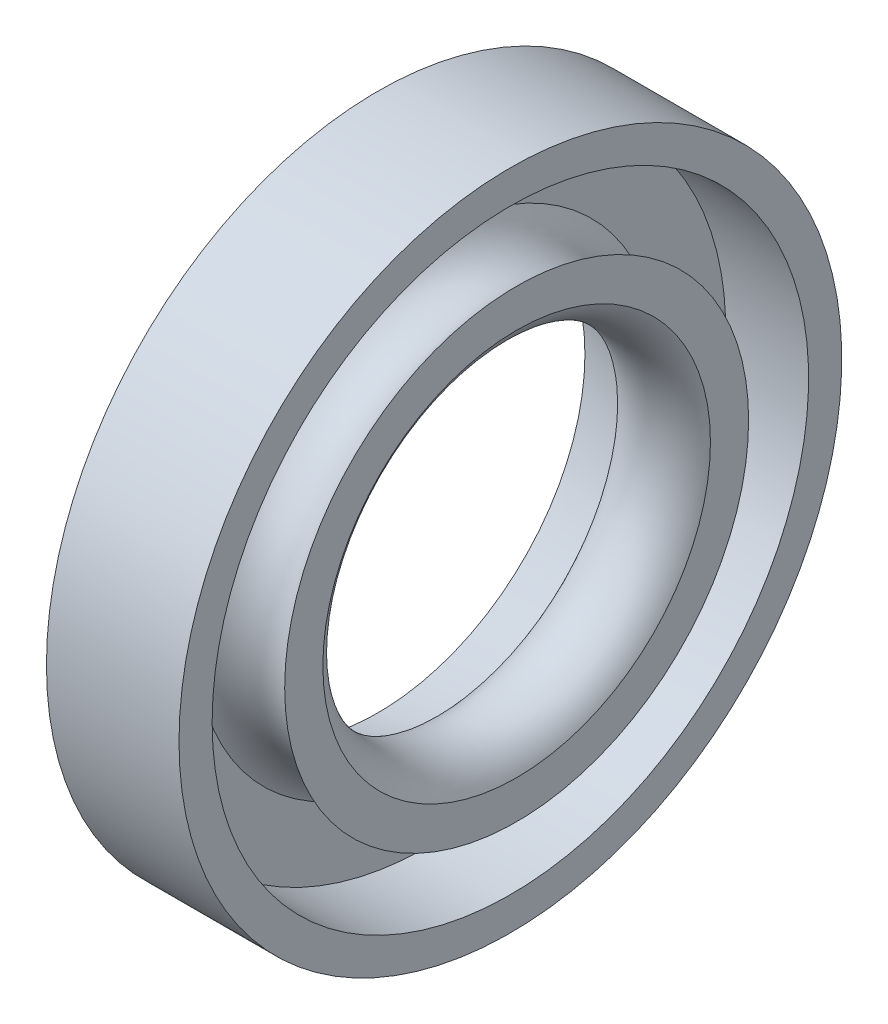
ISO-10303-21;
HEADER;
FILE_DESCRIPTION(('STEP AP214'),'2;1');
FILE_NAME('part.step','',(''),(''),'','','');
FILE_SCHEMA(('AUTOMOTIVE_DESIGN { 1 0 10303 214 1 1 1 1 }'));
ENDSEC;
DATA;
#1=APPLICATION_CONTEXT('core data for automotive mechanical design processes');
#2=APPLICATION_PROTOCOL_DEFINITION('international standard','automotive_design',2000,#1);
#3=PRODUCT_CONTEXT('',#1,'mechanical');
#4=PRODUCT('Part','Part','',(#3));
#5=PRODUCT_RELATED_PRODUCT_CATEGORY('part','',(#4));
#6=PRODUCT_DEFINITION_FORMATION('','',#4);
#7=PRODUCT_DEFINITION_CONTEXT('part definition',#1,'design');
#8=PRODUCT_DEFINITION('design','',#6,#7);
#9=PRODUCT_DEFINITION_SHAPE('','',#8);
#10=(LENGTH_UNIT() NAMED_UNIT(*) SI_UNIT(.MILLI.,.METRE.));
#11=(NAMED_UNIT(*) PLANE_ANGLE_UNIT() SI_UNIT($,.RADIAN.));
#12=(NAMED_UNIT(*) SI_UNIT($,.STERADIAN.) SOLID_ANGLE_UNIT());
#13=UNCERTAINTY_MEASURE_WITH_UNIT(LENGTH_MEASURE(1.E-05),#10,'distance_accuracy_value','');
#14=(GEOMETRIC_REPRESENTATION_CONTEXT(3) GLOBAL_UNCERTAINTY_ASSIGNED_CONTEXT((#13)) GLOBAL_UNIT_ASSIGNED_CONTEXT((#10,
#11,#12)) REPRESENTATION_CONTEXT('',''));
#15=CARTESIAN_POINT('',(0.,0.,0.));
#16=DIRECTION('',(0.,0.,1.));
#17=DIRECTION('',(1.,0.,0.));
#18=AXIS2_PLACEMENT_3D('',#15,#16,#17);
#19=CARTESIAN_POINT('',(-32.,18.,0.));
#20=DIRECTION('',(-1.,0.,0.));
#21=DIRECTION('',(0.,0.,1.));
#22=AXIS2_PLACEMENT_3D('',#19,#20,#21);
#23=PLANE('',#22);
#24=CARTESIAN_POINT('',(-32.,0.,0.));
#25=DIRECTION('',(-1.,0.,0.));
#26=DIRECTION('',(0.,0.,1.));
#27=AXIS2_PLACEMENT_3D('',#24,#25,#26);
#28=CIRCLE('',#27,20.);
#29=CARTESIAN_POINT('',(-32.,0.,20.));
#30=VERTEX_POINT('',#29);
#31=EDGE_CURVE('E45',#30,#30,#28,.T.);
#32=ORIENTED_EDGE('',*,*,#31,.F.);
#33=EDGE_LOOP('',(#32));
#34=FACE_BOUND('',#33,.T.);
#35=CARTESIAN_POINT('',(-32.,0.,0.));
#36=DIRECTION('',(-1.,0.,0.));
#37=DIRECTION('',(0.,0.,1.));
#38=AXIS2_PLACEMENT_3D('',#35,#36,#37);
#39=CIRCLE('',#38,18.);
#40=CARTESIAN_POINT('',(-32.,0.,18.));
#41=VERTEX_POINT('',#40);
#42=EDGE_CURVE('E10',#41,#41,#39,.T.);
#43=ORIENTED_EDGE('',*,*,#42,.T.);
#44=EDGE_LOOP('',(#43));
#45=FACE_BOUND('',#44,.T.);
#46=ADVANCED_FACE('F14',(#34,#45),#23,.F.);
#47=CARTESIAN_POINT('',(-120.,0.,0.));
#48=DIRECTION('',(-1.,0.,0.));
#49=DIRECTION('',(0.,0.,1.));
#50=AXIS2_PLACEMENT_3D('',#47,#48,#49);
#51=CYLINDRICAL_SURFACE('',#50,18.);
#52=ORIENTED_EDGE('',*,*,#42,.F.);
#53=EDGE_LOOP('',(#52));
#54=FACE_BOUND('',#53,.T.);
#55=CARTESIAN_POINT('',(-37.,0.,0.));
#56=DIRECTION('',(-1.,0.,0.));
#57=DIRECTION('',(0.,0.,1.));
#58=AXIS2_PLACEMENT_3D('',#55,#56,#57);
#59=CIRCLE('',#58,18.);
#60=CARTESIAN_POINT('',(-37.,0.,18.));
#61=VERTEX_POINT('',#60);
#62=EDGE_CURVE('E20',#61,#61,#59,.T.);
#63=ORIENTED_EDGE('',*,*,#62,.T.);
#64=EDGE_LOOP('',(#63));
#65=FACE_BOUND('',#64,.T.);
#66=ADVANCED_FACE('F52',(#54,#65),#51,.F.);
#67=CARTESIAN_POINT('',(-37.,14.,0.));
#68=DIRECTION('',(-1.,0.,0.));
#69=DIRECTION('',(0.,0.,1.));
#70=AXIS2_PLACEMENT_3D('',#67,#68,#69);
#71=PLANE('',#70);
#72=ORIENTED_EDGE('',*,*,#62,.F.);
#73=EDGE_LOOP('',(#72));
#74=FACE_BOUND('',#73,.T.);
#75=CARTESIAN_POINT('',(-37.,0.,0.));
#76=DIRECTION('',(-1.,0.,0.));
#77=DIRECTION('',(0.,0.,1.));
#78=AXIS2_PLACEMENT_3D('',#75,#76,#77);
#79=CIRCLE('',#78,14.);
#80=CARTESIAN_POINT('',(-37.,0.,14.));
#81=VERTEX_POINT('',#80);
#82=EDGE_CURVE('E24',#81,#81,#79,.T.);
#83=ORIENTED_EDGE('',*,*,#82,.T.);
#84=EDGE_LOOP('',(#83));
#85=FACE_BOUND('',#84,.T.);
#86=ADVANCED_FACE('F57',(#74,#85),#71,.F.);
#87=CARTESIAN_POINT('',(-34.3105288852963,0.,0.));
#88=DIRECTION('',(-1.,0.,0.));
#89=DIRECTION('',(0.,0.,1.));
#90=AXIS2_PLACEMENT_3D('',#87,#88,#89);
#91=TOROIDAL_SURFACE('',#90,15.3291896490623,3.);
#92=ORIENTED_EDGE('',*,*,#82,.F.);
#93=EDGE_LOOP('',(#92));
#94=FACE_BOUND('',#93,.T.);
#95=CARTESIAN_POINT('',(-31.6210577705927,0.,0.));
#96=DIRECTION('',(-1.,0.,0.));
#97=DIRECTION('',(0.,0.,1.));
#98=AXIS2_PLACEMENT_3D('',#95,#96,#97);
#99=CIRCLE('',#98,13.9999999999998);
#100=CARTESIAN_POINT('',(-31.6210577705927,0.,13.9999999999998));
#101=VERTEX_POINT('',#100);
#102=EDGE_CURVE('E28',#101,#101,#99,.T.);
#103=ORIENTED_EDGE('',*,*,#102,.T.);
#104=EDGE_LOOP('',(#103));
#105=FACE_BOUND('',#104,.T.);
#106=ADVANCED_FACE('F62',(#94,#105),#91,.F.);
#107=CARTESIAN_POINT('',(-31.6210577705927,11.6961524227065,0.));
#108=DIRECTION('',(-1.,0.,0.));
#109=DIRECTION('',(0.,0.,1.));
#110=AXIS2_PLACEMENT_3D('',#107,#108,#109);
#111=PLANE('',#110);
#112=ORIENTED_EDGE('',*,*,#102,.F.);
#113=EDGE_LOOP('',(#112));
#114=FACE_BOUND('',#113,.T.);
#115=CARTESIAN_POINT('',(-31.6210577705927,0.,0.));
#116=DIRECTION('',(-1.,0.,0.));
#117=DIRECTION('',(0.,0.,1.));
#118=AXIS2_PLACEMENT_3D('',#115,#116,#117);
#119=CIRCLE('',#118,11.6961524227065);
#120=CARTESIAN_POINT('',(-31.6210577705927,0.,11.6961524227065));
#121=VERTEX_POINT('',#120);
#122=EDGE_CURVE('E33',#121,#121,#119,.T.);
#123=ORIENTED_EDGE('',*,*,#122,.T.);
#124=EDGE_LOOP('',(#123));
#125=FACE_BOUND('',#124,.T.);
#126=ADVANCED_FACE('F68',(#114,#125),#111,.F.);
#127=CARTESIAN_POINT('',(-34.3105288852963,0.,0.));
#128=DIRECTION('',(-1.,0.,0.));
#129=DIRECTION('',(0.,0.,1.));
#130=AXIS2_PLACEMENT_3D('',#127,#128,#129);
#131=TOROIDAL_SURFACE('',#130,13.025342071769,3.);
#132=ORIENTED_EDGE('',*,*,#122,.F.);
#133=EDGE_LOOP('',(#132));
#134=FACE_BOUND('',#133,.T.);
#135=CARTESIAN_POINT('',(-37.,0.,0.));
#136=DIRECTION('',(-1.,0.,0.));
#137=DIRECTION('',(0.,0.,1.));
#138=AXIS2_PLACEMENT_3D('',#135,#136,#137);
#139=CIRCLE('',#138,11.6961524227066);
#140=CARTESIAN_POINT('',(-37.,0.,11.6961524227066));
#141=VERTEX_POINT('',#140);
#142=EDGE_CURVE('E36',#141,#141,#139,.T.);
#143=ORIENTED_EDGE('',*,*,#142,.T.);
#144=EDGE_LOOP('',(#143));
#145=FACE_BOUND('',#144,.T.);
#146=ADVANCED_FACE('F72',(#134,#145),#131,.T.);
#147=CARTESIAN_POINT('',(-40.,0.,0.));
#148=DIRECTION('',(-1.,0.,0.));
#149=DIRECTION('',(0.,0.,1.));
#150=AXIS2_PLACEMENT_3D('',#147,#148,#149);
#151=CONICAL_SURFACE('',#150,12.5,0.261799387799145);
#152=ORIENTED_EDGE('',*,*,#142,.F.);
#153=EDGE_LOOP('',(#152));
#154=FACE_BOUND('',#153,.T.);
#155=CARTESIAN_POINT('',(-40.,0.,0.));
#156=DIRECTION('',(-1.,0.,0.));
#157=DIRECTION('',(0.,0.,1.));
#158=AXIS2_PLACEMENT_3D('',#155,#156,#157);
#159=CIRCLE('',#158,12.5);
#160=CARTESIAN_POINT('',(-40.,0.,12.5));
#161=VERTEX_POINT('',#160);
#162=EDGE_CURVE('E39',#161,#161,#159,.T.);
#163=ORIENTED_EDGE('',*,*,#162,.T.);
#164=EDGE_LOOP('',(#163));
#165=FACE_BOUND('',#164,.T.);
#166=ADVANCED_FACE('F76',(#154,#165),#151,.F.);
#167=CARTESIAN_POINT('',(-40.,20.,0.));
#168=DIRECTION('',(1.,0.,0.));
#169=DIRECTION('',(0.,0.,-1.));
#170=AXIS2_PLACEMENT_3D('',#167,#168,#169);
#171=PLANE('',#170);
#172=ORIENTED_EDGE('',*,*,#162,.F.);
#173=EDGE_LOOP('',(#172));
#174=FACE_BOUND('',#173,.T.);
#175=CARTESIAN_POINT('',(-40.,0.,0.));
#176=DIRECTION('',(-1.,0.,0.));
#177=DIRECTION('',(0.,0.,1.));
#178=AXIS2_PLACEMENT_3D('',#175,#176,#177);
#179=CIRCLE('',#178,20.);
#180=CARTESIAN_POINT('',(-40.,0.,20.));
#181=VERTEX_POINT('',#180);
#182=EDGE_CURVE('E42',#181,#181,#179,.T.);
#183=ORIENTED_EDGE('',*,*,#182,.T.);
#184=EDGE_LOOP('',(#183));
#185=FACE_BOUND('',#184,.T.);
#186=ADVANCED_FACE('F80',(#174,#185),#171,.F.);
#187=CARTESIAN_POINT('',(-120.,0.,0.));
#188=DIRECTION('',(-1.,0.,0.));
#189=DIRECTION('',(0.,0.,1.));
#190=AXIS2_PLACEMENT_3D('',#187,#188,#189);
#191=CYLINDRICAL_SURFACE('',#190,20.);
#192=ORIENTED_EDGE('',*,*,#182,.F.);
#193=EDGE_LOOP('',(#192));
#194=FACE_BOUND('',#193,.T.);
#195=ORIENTED_EDGE('',*,*,#31,.T.);
#196=EDGE_LOOP('',(#195));
#197=FACE_BOUND('',#196,.T.);
#198=ADVANCED_FACE('F49',(#194,#197),#191,.T.);
#199=CLOSED_SHELL('',(#46,#66,#86,#106,#126,#146,#166,#186,#198));
#200=MANIFOLD_SOLID_BREP('B1',#199);
#201=ADVANCED_BREP_SHAPE_REPRESENTATION('',(#18,#200),#14);
#202=SHAPE_DEFINITION_REPRESENTATION(#9,#201);
ENDSEC;
END-ISO-10303-21;
